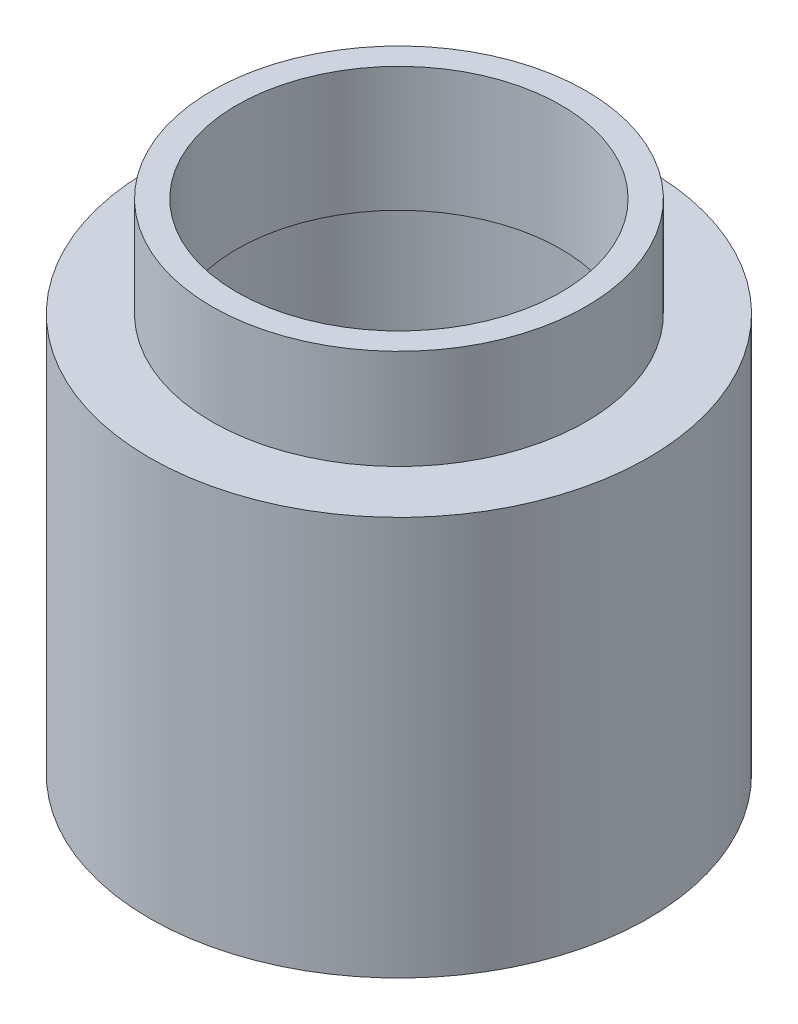
ISO-10303-21;
HEADER;
FILE_DESCRIPTION(('STEP AP214'),'2;1');
FILE_NAME('part.step','',(''),(''),'','','');
FILE_SCHEMA(('AUTOMOTIVE_DESIGN { 1 0 10303 214 1 1 1 1 }'));
ENDSEC;
DATA;
#1=APPLICATION_CONTEXT('core data for automotive mechanical design processes');
#2=APPLICATION_PROTOCOL_DEFINITION('international standard','automotive_design',2000,#1);
#3=PRODUCT_CONTEXT('',#1,'mechanical');
#4=PRODUCT('Part','Part','',(#3));
#5=PRODUCT_RELATED_PRODUCT_CATEGORY('part','',(#4));
#6=PRODUCT_DEFINITION_FORMATION('','',#4);
#7=PRODUCT_DEFINITION_CONTEXT('part definition',#1,'design');
#8=PRODUCT_DEFINITION('design','',#6,#7);
#9=PRODUCT_DEFINITION_SHAPE('','',#8);
#10=(LENGTH_UNIT() NAMED_UNIT(*) SI_UNIT(.MILLI.,.METRE.));
#11=(NAMED_UNIT(*) PLANE_ANGLE_UNIT() SI_UNIT($,.RADIAN.));
#12=(NAMED_UNIT(*) SI_UNIT($,.STERADIAN.) SOLID_ANGLE_UNIT());
#13=UNCERTAINTY_MEASURE_WITH_UNIT(LENGTH_MEASURE(1.E-05),#10,'distance_accuracy_value','');
#14=(GEOMETRIC_REPRESENTATION_CONTEXT(3) GLOBAL_UNCERTAINTY_ASSIGNED_CONTEXT((#13)) GLOBAL_UNIT_ASSIGNED_CONTEXT((#10,
#11,#12)) REPRESENTATION_CONTEXT('',''));
#15=CARTESIAN_POINT('',(0.,0.,0.));
#16=DIRECTION('',(0.,0.,1.));
#17=DIRECTION('',(1.,0.,0.));
#18=AXIS2_PLACEMENT_3D('',#15,#16,#17);
#19=CARTESIAN_POINT('',(0.,0.,0.));
#20=DIRECTION('',(0.,1.,0.));
#21=DIRECTION('',(0.,0.,1.));
#22=AXIS2_PLACEMENT_3D('',#19,#20,#21);
#23=PLANE('',#22);
#24=CARTESIAN_POINT('',(0.,0.,0.));
#25=DIRECTION('',(0.,1.,0.));
#26=DIRECTION('',(0.,0.,1.));
#27=AXIS2_PLACEMENT_3D('',#24,#25,#26);
#28=CIRCLE('',#27,16.51);
#29=CARTESIAN_POINT('',(0.,0.,16.51));
#30=VERTEX_POINT('',#29);
#31=EDGE_CURVE('E119',#30,#30,#28,.T.);
#32=ORIENTED_EDGE('',*,*,#31,.T.);
#33=EDGE_LOOP('',(#32));
#34=FACE_BOUND('',#33,.T.);
#35=CARTESIAN_POINT('',(0.,0.,0.));
#36=DIRECTION('',(0.,1.,0.));
#37=DIRECTION('',(0.,0.,1.));
#38=AXIS2_PLACEMENT_3D('',#35,#36,#37);
#39=CIRCLE('',#38,19.05);
#40=CARTESIAN_POINT('',(0.,0.,19.05));
#41=VERTEX_POINT('',#40);
#42=EDGE_CURVE('E10',#41,#41,#39,.T.);
#43=ORIENTED_EDGE('',*,*,#42,.F.);
#44=EDGE_LOOP('',(#43));
#45=FACE_BOUND('',#44,.T.);
#46=ADVANCED_FACE('F43',(#34,#45),#23,.F.);
#47=CARTESIAN_POINT('',(0.,12.7,0.));
#48=DIRECTION('',(0.,-1.,0.));
#49=DIRECTION('',(0.,0.,-1.));
#50=AXIS2_PLACEMENT_3D('',#47,#48,#49);
#51=CYLINDRICAL_SURFACE('',#50,19.05);
#52=CARTESIAN_POINT('',(0.,2.54,0.));
#53=DIRECTION('',(0.,1.,0.));
#54=DIRECTION('',(0.,0.,1.));
#55=AXIS2_PLACEMENT_3D('',#52,#53,#54);
#56=CIRCLE('',#55,19.05);
#57=CARTESIAN_POINT('',(0.,2.54,19.05));
#58=VERTEX_POINT('',#57);
#59=EDGE_CURVE('E66',#58,#58,#56,.T.);
#60=ORIENTED_EDGE('',*,*,#59,.T.);
#61=EDGE_LOOP('',(#60));
#62=FACE_BOUND('',#61,.T.);
#63=CARTESIAN_POINT('',(0.,12.7,0.));
#64=DIRECTION('',(0.,1.,0.));
#65=DIRECTION('',(0.,0.,1.));
#66=AXIS2_PLACEMENT_3D('',#63,#64,#65);
#67=CIRCLE('',#66,19.05);
#68=CARTESIAN_POINT('',(0.,12.7,19.05));
#69=VERTEX_POINT('',#68);
#70=EDGE_CURVE('E47',#69,#69,#67,.T.);
#71=ORIENTED_EDGE('',*,*,#70,.F.);
#72=EDGE_LOOP('',(#71));
#73=FACE_BOUND('',#72,.T.);
#74=ADVANCED_FACE('F45',(#62,#73),#51,.T.);
#75=CARTESIAN_POINT('',(0.,12.7,0.));
#76=DIRECTION('',(0.,1.,0.));
#77=DIRECTION('',(0.,0.,1.));
#78=AXIS2_PLACEMENT_3D('',#75,#76,#77);
#79=PLANE('',#78);
#80=CARTESIAN_POINT('',(0.,12.7,0.));
#81=DIRECTION('',(0.,1.,0.));
#82=DIRECTION('',(0.,0.,1.));
#83=AXIS2_PLACEMENT_3D('',#80,#81,#82);
#84=CIRCLE('',#83,16.51);
#85=CARTESIAN_POINT('',(0.,12.7,16.51));
#86=VERTEX_POINT('',#85);
#87=EDGE_CURVE('E57',#86,#86,#84,.T.);
#88=ORIENTED_EDGE('',*,*,#87,.F.);
#89=EDGE_LOOP('',(#88));
#90=FACE_BOUND('',#89,.T.);
#91=ORIENTED_EDGE('',*,*,#70,.T.);
#92=EDGE_LOOP('',(#91));
#93=FACE_BOUND('',#92,.T.);
#94=ADVANCED_FACE('F106',(#90,#93),#79,.T.);
#95=CARTESIAN_POINT('',(0.,12.7,0.));
#96=DIRECTION('',(0.,-1.,0.));
#97=DIRECTION('',(0.,0.,-1.));
#98=AXIS2_PLACEMENT_3D('',#95,#96,#97);
#99=CYLINDRICAL_SURFACE('',#98,16.51);
#100=ORIENTED_EDGE('',*,*,#87,.T.);
#101=EDGE_LOOP('',(#100));
#102=FACE_BOUND('',#101,.T.);
#103=ORIENTED_EDGE('',*,*,#31,.F.);
#104=EDGE_LOOP('',(#103));
#105=FACE_BOUND('',#104,.T.);
#106=ADVANCED_FACE('F99',(#102,#105),#99,.F.);
#107=CARTESIAN_POINT('',(0.,2.54,0.));
#108=DIRECTION('',(0.,1.,0.));
#109=DIRECTION('',(0.,0.,1.));
#110=AXIS2_PLACEMENT_3D('',#107,#108,#109);
#111=PLANE('',#110);
#112=CARTESIAN_POINT('',(0.,2.54,0.));
#113=DIRECTION('',(0.,1.,0.));
#114=DIRECTION('',(0.,0.,1.));
#115=AXIS2_PLACEMENT_3D('',#112,#113,#114);
#116=CIRCLE('',#115,25.4);
#117=CARTESIAN_POINT('',(0.,2.54,25.4));
#118=VERTEX_POINT('',#117);
#119=EDGE_CURVE('E122',#118,#118,#116,.T.);
#120=ORIENTED_EDGE('',*,*,#119,.T.);
#121=EDGE_LOOP('',(#120));
#122=FACE_BOUND('',#121,.T.);
#123=ORIENTED_EDGE('',*,*,#59,.F.);
#124=EDGE_LOOP('',(#123));
#125=FACE_BOUND('',#124,.T.);
#126=ADVANCED_FACE('F95',(#122,#125),#111,.T.);
#127=CARTESIAN_POINT('',(0.,2.54,0.));
#128=DIRECTION('',(0.,-1.,0.));
#129=DIRECTION('',(0.,0.,-1.));
#130=AXIS2_PLACEMENT_3D('',#127,#128,#129);
#131=CYLINDRICAL_SURFACE('',#130,25.4);
#132=ORIENTED_EDGE('',*,*,#119,.F.);
#133=EDGE_LOOP('',(#132));
#134=FACE_BOUND('',#133,.T.);
#135=CARTESIAN_POINT('',(-23.5464301965287,-19.05,-9.525));
#136=CARTESIAN_POINT('',(-23.5464290597665,-19.3071777852419,-9.52500125222874));
#137=CARTESIAN_POINT('',(-23.5506548764508,-19.5643386914946,-9.51457581781126));
#138=CARTESIAN_POINT('',(-23.5674130086475,-20.0767067934272,-9.47299060902992));
#139=CARTESIAN_POINT('',(-23.5799451961018,-20.3319140191654,-9.44183115431928));
#140=CARTESIAN_POINT('',(-23.6129001050751,-20.8384520206948,-9.35910904505806));
#141=CARTESIAN_POINT('',(-23.6333221967351,-21.0897831042571,-9.30754801917728));
#142=CARTESIAN_POINT('',(-23.6813986634046,-21.586821539874,-9.18453650181596));
#143=CARTESIAN_POINT('',(-23.7090532513456,-21.832528726124,-9.11308542474942));
#144=CARTESIAN_POINT('',(-23.7706548641663,-22.3160399526018,-8.95116981501976));
#145=CARTESIAN_POINT('',(-23.804585070284,-22.5538631590036,-8.86075601798978));
#146=CARTESIAN_POINT('',(-23.8777983041001,-23.0209066882999,-8.66152453393985));
#147=CARTESIAN_POINT('',(-23.9170832005942,-23.250123971933,-8.55270041847714));
#148=CARTESIAN_POINT('',(-23.9998946503517,-23.6985632919238,-8.31748730151723));
#149=CARTESIAN_POINT('',(-24.0434213632411,-23.9177849516752,-8.19109763892608));
#150=CARTESIAN_POINT('',(-24.1335514315899,-24.3450496760543,-7.9216082893283));
#151=CARTESIAN_POINT('',(-24.180155004329,-24.553091949338,-7.77850742167155));
#152=CARTESIAN_POINT('',(-24.2773902026361,-24.9660265194793,-7.46965191018819));
#153=CARTESIAN_POINT('',(-24.3281086845112,-25.170351551261,-7.30316574399795));
#154=CARTESIAN_POINT('',(-24.4302238492155,-25.5644215558846,-6.95393804783615));
#155=CARTESIAN_POINT('',(-24.4816205471923,-25.7541662024328,-6.7711961542757));
#156=CARTESIAN_POINT('',(-24.5837456766822,-26.1180036584668,-6.39048448784824));
#157=CARTESIAN_POINT('',(-24.6344739537302,-26.2920929024692,-6.19251126503328));
#158=CARTESIAN_POINT('',(-24.7339242741546,-26.6234814564271,-5.78251509886594));
#159=CARTESIAN_POINT('',(-24.7826463794314,-26.780781284658,-5.57049258953101));
#160=CARTESIAN_POINT('',(-24.8784348859977,-27.0826420848376,-5.12609871382996));
#161=CARTESIAN_POINT('',(-24.9253868752098,-27.2265796385702,-4.89327847619604));
#162=CARTESIAN_POINT('',(-25.0144447274539,-27.4941688553475,-4.41549263047845));
#163=CARTESIAN_POINT('',(-25.0565525342592,-27.617828663559,-4.17053195071252));
#164=CARTESIAN_POINT('',(-25.1347341943146,-27.8438464685769,-3.67005072001727));
#165=CARTESIAN_POINT('',(-25.1708083661773,-27.9462055902585,-3.41453072757281));
#166=CARTESIAN_POINT('',(-25.2358637350264,-28.1286405096969,-2.89478046178847));
#167=CARTESIAN_POINT('',(-25.2648453247438,-28.2087175412929,-2.63055067164786));
#168=CARTESIAN_POINT('',(-25.3137670251751,-28.3428009614553,-2.10697045886651));
#169=CARTESIAN_POINT('',(-25.3340431627404,-28.3977827572438,-1.8479010519304));
#170=CARTESIAN_POINT('',(-25.3667350446999,-28.4860243872021,-1.32559688578523));
#171=CARTESIAN_POINT('',(-25.3791509954178,-28.5192847915419,-1.0623622360964));
#172=CARTESIAN_POINT('',(-25.3957651101869,-28.5637235453757,-0.533850308196677));
#173=CARTESIAN_POINT('',(-25.3999655577773,-28.5749080309867,-0.268573618168059));
#174=CARTESIAN_POINT('',(-25.4000340149168,-28.5750908295271,0.261984629792008));
#175=CARTESIAN_POINT('',(-25.3959022764224,-28.5640898133224,0.5272661873337));
#176=CARTESIAN_POINT('',(-25.3798361799296,-28.5211180550047,1.04262353852333));
#177=CARTESIAN_POINT('',(-25.3682985678342,-28.4902133237822,1.29280148232164));
#178=CARTESIAN_POINT('',(-25.3381058781439,-28.4087747298098,1.78949444136041));
#179=CARTESIAN_POINT('',(-25.3194510793465,-28.3582416359493,2.0360095996882));
#180=CARTESIAN_POINT('',(-25.2755020244822,-28.238022299151,2.52367464887114));
#181=CARTESIAN_POINT('',(-25.2502087103332,-28.1683387733412,2.76482529561845));
#182=CARTESIAN_POINT('',(-25.1936024946416,-28.010394281841,3.24033174905699));
#183=CARTESIAN_POINT('',(-25.1622873026068,-27.9221262460972,3.47468493109316));
#184=CARTESIAN_POINT('',(-25.0939280822682,-27.7263690283485,3.93833241293282));
#185=CARTESIAN_POINT('',(-25.0568092881533,-27.6186256343564,4.16750827246817));
#186=CARTESIAN_POINT('',(-24.97807179511,-27.3855698511999,4.61603742377733));
#187=CARTESIAN_POINT('',(-24.9364514452915,-27.2602510114247,4.83538706991793));
#188=CARTESIAN_POINT('',(-24.8497227904938,-26.9929420173091,5.26297195415743));
#189=CARTESIAN_POINT('',(-24.8046142267526,-26.8509506257628,5.47120636576771));
#190=CARTESIAN_POINT('',(-24.7119849492327,-26.5512091548956,5.8754409825829));
#191=CARTESIAN_POINT('',(-24.664464123718,-26.3934583452699,6.0714406201334));
#192=CARTESIAN_POINT('',(-24.5653044601238,-26.0534124139632,6.46131714145069));
#193=CARTESIAN_POINT('',(-24.5135877499819,-25.8702196366974,6.65439212114292));
#194=CARTESIAN_POINT('',(-24.4101178907345,-25.4884180621478,7.02446113412108));
#195=CARTESIAN_POINT('',(-24.3583647646491,-25.289815494464,7.20146160356529));
#196=CARTESIAN_POINT('',(-24.2561740388739,-24.8781538071072,7.53850505058875));
#197=CARTESIAN_POINT('',(-24.2057373451799,-24.665085076752,7.69853657029526));
#198=CARTESIAN_POINT('',(-24.1076524675075,-24.2259359687333,8.0003922086817));
#199=CARTESIAN_POINT('',(-24.0600031849107,-23.9998607880184,8.14222352738153));
#200=CARTESIAN_POINT('',(-23.9678285375499,-23.5306824556341,8.40973679818271));
#201=CARTESIAN_POINT('',(-23.9233987372099,-23.2873091376557,8.53497865549717));
#202=CARTESIAN_POINT('',(-23.840335948329,-22.7899617693195,8.76431754101062));
#203=CARTESIAN_POINT('',(-23.8017004918262,-22.5359922913952,8.86842357822682));
#204=CARTESIAN_POINT('',(-23.7315183910797,-22.0191914690703,9.05455336827552));
#205=CARTESIAN_POINT('',(-23.6999701007713,-21.7563621987878,9.13658224962521));
#206=CARTESIAN_POINT('',(-23.6450754412344,-21.2237850705233,9.27772367353786));
#207=CARTESIAN_POINT('',(-23.6217285087169,-20.9540376890598,9.33683778997104));
#208=CARTESIAN_POINT('',(-23.5851386611022,-20.4248388104504,9.42886764305426));
#209=CARTESIAN_POINT('',(-23.5714092694367,-20.1656405850583,9.46304907745533));
#210=CARTESIAN_POINT('',(-23.5525103323657,-19.6450021692584,9.5099897241637));
#211=CARTESIAN_POINT('',(-23.5473404711563,-19.3835620619225,9.52274972681493));
#212=CARTESIAN_POINT('',(-23.5457404287336,-18.8605512444613,9.52670515664306));
#213=CARTESIAN_POINT('',(-23.5493083255811,-18.5989805757071,9.51790532607603));
#214=CARTESIAN_POINT('',(-23.5650557589161,-18.077712333086,9.47884957901896));
#215=CARTESIAN_POINT('',(-23.5772351282222,-17.8180147229548,9.44859407906466));
#216=CARTESIAN_POINT('',(-23.6090073205275,-17.3148107371196,9.36891185181175));
#217=CARTESIAN_POINT('',(-23.628218381802,-17.0711233563398,9.32046953398875));
#218=CARTESIAN_POINT('',(-23.6734924042216,-16.588792941596,9.20486870114743));
#219=CARTESIAN_POINT('',(-23.6995577621792,-16.3501517037682,9.13770363866013));
#220=CARTESIAN_POINT('',(-23.7577688433731,-15.8795545605533,8.98526939166543));
#221=CARTESIAN_POINT('',(-23.7899132220107,-15.6475971898333,8.90000421015404));
#222=CARTESIAN_POINT('',(-23.8593997580177,-15.1915814048209,8.7120079557696));
#223=CARTESIAN_POINT('',(-23.8967439350965,-14.9675261024425,8.60927009269498));
#224=CARTESIAN_POINT('',(-23.9770865535003,-14.5204932861121,8.38297440303938));
#225=CARTESIAN_POINT('',(-24.0202432424086,-14.2978633851671,8.25878613594989));
#226=CARTESIAN_POINT('',(-24.1099023102733,-13.8636552952139,7.99326262957687));
#227=CARTESIAN_POINT('',(-24.1564061724229,-13.6520820781934,7.85191976950677));
#228=CARTESIAN_POINT('',(-24.2515277559896,-13.2411981868087,7.55301232322762));
#229=CARTESIAN_POINT('',(-24.300145685448,-13.041888723979,7.3954461384161));
#230=CARTESIAN_POINT('',(-24.3982614149993,-12.6566051530506,7.06502224550078));
#231=CARTESIAN_POINT('',(-24.4477592437285,-12.4706314799594,6.89216403898877));
#232=CARTESIAN_POINT('',(-24.5495573261128,-12.1016321420379,6.52063241640119));
#233=CARTESIAN_POINT('',(-24.6018353307814,-11.919548254646,6.32101606690111));
#234=CARTESIAN_POINT('',(-24.7045502724577,-11.5728454646602,5.90683487903882));
#235=CARTESIAN_POINT('',(-24.754987849418,-11.4082204525747,5.69227531368163));
#236=CARTESIAN_POINT('',(-24.8526837942627,-11.0974348700793,5.249338557052));
#237=CARTESIAN_POINT('',(-24.8999407629226,-10.9512824016744,5.02095536727513));
#238=CARTESIAN_POINT('',(-24.9899267545733,-10.6787029987675,4.55198143954471));
#239=CARTESIAN_POINT('',(-25.0326577143075,-10.5522676160165,4.31139598882043));
#240=CARTESIAN_POINT('',(-25.1122880914012,-10.3204839111231,3.82029576848357));
#241=CARTESIAN_POINT('',(-25.149205696098,-10.2150695365466,3.5698151619456));
#242=CARTESIAN_POINT('',(-25.2163200404727,-10.0257960297509,3.05995235124164));
#243=CARTESIAN_POINT('',(-25.2465167456233,-9.9419370082673,2.80057010135325));
#244=CARTESIAN_POINT('',(-25.299295784839,-9.79664517418848,2.27494324740567));
#245=CARTESIAN_POINT('',(-25.3218810698969,-9.73520366942293,2.0087013460705));
#246=CARTESIAN_POINT('',(-25.3587770160651,-9.63536483826512,1.47136991413814));
#247=CARTESIAN_POINT('',(-25.3730881530876,-9.59696618648971,1.20028066327552));
#248=CARTESIAN_POINT('',(-25.3924228449267,-9.54519611945499,0.671388002777045));
#249=CARTESIAN_POINT('',(-25.3979394015329,-9.53049564972833,0.413731858735038));
#250=CARTESIAN_POINT('',(-25.4011039188786,-9.5220556426682,-0.101966351062404));
#251=CARTESIAN_POINT('',(-25.3987522044313,-9.52831524007435,-0.360008400447584));
#252=CARTESIAN_POINT('',(-25.3862451729956,-9.56172793143172,-0.87451230794166));
#253=CARTESIAN_POINT('',(-25.3760907453383,-9.58887864427388,-1.13097434277835));
#254=CARTESIAN_POINT('',(-25.3482544470697,-9.66379541281054,-1.64045214939321));
#255=CARTESIAN_POINT('',(-25.3305725817149,-9.71156145410952,-1.89346792357775));
#256=CARTESIAN_POINT('',(-25.2886781423474,-9.82581357119041,-2.38806145838755));
#257=CARTESIAN_POINT('',(-25.2646373033226,-9.89180914843507,-2.6297674266934));
#258=CARTESIAN_POINT('',(-25.2104358600319,-10.0424122873472,-3.10669395335431));
#259=CARTESIAN_POINT('',(-25.1802730864285,-10.1270264474974,-3.34191217909091));
#260=CARTESIAN_POINT('',(-25.1145774610085,-10.314137476132,-3.80427620586803));
#261=CARTESIAN_POINT('',(-25.0790458524841,-10.4166302052192,-4.03142386085422));
#262=CARTESIAN_POINT('',(-25.0034419535676,-10.6387787219132,-4.47647923989422));
#263=CARTESIAN_POINT('',(-24.9633679099967,-10.7584411410291,-4.69438335145395));
#264=CARTESIAN_POINT('',(-24.8778841649032,-11.0193980481146,-5.12853235655687));
#265=CARTESIAN_POINT('',(-24.8323218063429,-11.1613856050804,-5.34433069314777));
#266=CARTESIAN_POINT('',(-24.7384203940128,-11.4621489620928,-5.76339264355948));
#267=CARTESIAN_POINT('',(-24.6900800947624,-11.620932319729,-5.96665054888657));
#268=CARTESIAN_POINT('',(-24.5918396142337,-11.9542575198173,-6.35943519656763));
#269=CARTESIAN_POINT('',(-24.5419392780876,-12.1288009300674,-6.54896056943187));
#270=CARTESIAN_POINT('',(-24.441830648007,-12.4926154585387,-6.91321918835163));
#271=CARTESIAN_POINT('',(-24.3916223470365,-12.6818869144081,-7.08795209509013));
#272=CARTESIAN_POINT('',(-24.2895319279912,-13.0845255356631,-7.43049493763688));
#273=CARTESIAN_POINT('',(-24.2377023859995,-13.2986383889335,-7.59744536565725));
#274=CARTESIAN_POINT('',(-24.1366362947896,-13.7406589745732,-7.91265963708757));
#275=CARTESIAN_POINT('',(-24.0873987945696,-13.9685615806806,-8.0609303621589));
#276=CARTESIAN_POINT('',(-23.9929513627474,-14.4369775692208,-8.33784791070401));
#277=CARTESIAN_POINT('',(-23.9477436999042,-14.6774979358009,-8.46648370857341));
#278=CARTESIAN_POINT('',(-23.8628356936396,-15.1693813237319,-8.70292216517828));
#279=CARTESIAN_POINT('',(-23.8231330061718,-15.4207396700742,-8.81073369872558));
#280=CARTESIAN_POINT('',(-23.7489279580391,-15.9440092618361,-9.00889139010164));
#281=CARTESIAN_POINT('',(-23.7147331802954,-16.2163378502519,-9.09825444597654));
#282=CARTESIAN_POINT('',(-23.6550750638227,-16.7688568674462,-9.25225690722239));
#283=CARTESIAN_POINT('',(-23.6296121179307,-17.0490476493243,-9.31689520026435));
#284=CARTESIAN_POINT('',(-23.5884513939255,-17.614672116342,-9.42062006137293));
#285=CARTESIAN_POINT('',(-23.5727481492134,-17.9001027741122,-9.45972093407209));
#286=CARTESIAN_POINT('',(-23.5517387963821,-18.4736962333098,-9.51190867801163));
#287=CARTESIAN_POINT('',(-23.546431470154,-18.7618587106685,-9.52499859700634));
#288=CARTESIAN_POINT('',(-23.5464301965287,-19.05,-9.525));
#289=B_SPLINE_CURVE_WITH_KNOTS('',3,(#135,#136,#137,#138,#139,#140,#141,#142,#143,#144,#145,
#146,#147,#148,#149,#150,#151,#152,#153,#154,#155,#156,#157,#158,#159,#160,#161,#162,#163,#164,
#165,#166,#167,#168,#169,#170,#171,#172,#173,#174,#175,#176,#177,#178,#179,#180,#181,#182,#183,
#184,#185,#186,#187,#188,#189,#190,#191,#192,#193,#194,#195,#196,#197,#198,#199,#200,#201,#202,
#203,#204,#205,#206,#207,#208,#209,#210,#211,#212,#213,#214,#215,#216,#217,#218,#219,#220,#221,
#222,#223,#224,#225,#226,#227,#228,#229,#230,#231,#232,#233,#234,#235,#236,#237,#238,#239,#240,
#241,#242,#243,#244,#245,#246,#247,#248,#249,#250,#251,#252,#253,#254,#255,#256,#257,#258,#259,
#260,#261,#262,#263,#264,#265,#266,#267,#268,#269,#270,#271,#272,#273,#274,#275,#276,#277,#278,
#279,#280,#281,#282,#283,#284,#285,#286,#287,#288),.UNSPECIFIED.,.T.,.F.,(4,2,2,2,2,2,2,2,2,2,2,
2,2,2,2,2,2,2,2,2,2,2,2,2,2,2,2,2,2,2,2,2,2,2,2,2,2,2,2,2,2,2,2,2,2,2,2,2,2,2,2,2,2,2,2,2,2,2,2,
2,2,2,2,2,2,2,2,2,2,2,2,2,2,2,2,2,4),(0.,0.771259809427028,1.54250772873512,2.31369409127157,
3.08490316082341,3.85407456304835,4.62351509796991,5.3929845992706,6.16250849667797,
6.96680952769195,7.77112855288545,8.57563029848293,9.38010720259339,10.2122259818743,
11.0440096924791,11.8757494659874,12.7074431739163,13.5032685607861,14.299073057008,
15.094656324043,15.8902155338532,16.6463565429429,17.4024679351818,18.1584721031182,
18.9147643969684,19.6817539764796,20.4490257998925,21.2163545956149,21.9837189665195,
22.7961869577687,23.6083281930449,24.4210143610544,25.2333780318109,26.0641974574152,
26.8946620042389,27.7249334675403,28.5551478946396,29.339548400318,30.1239199648961,
30.9081190162259,31.6923028437015,32.4390419311283,33.186042486521,33.9328780081518,
34.680004429622,35.454816941628,36.2299749263249,37.0052093662232,37.7804690824181,
38.6050943840852,39.4294301607026,40.2541262431857,41.0784679885576,41.9001771843379,
42.7218906013767,43.5432850677226,44.3646322844182,45.13807579785,45.911487382864,
46.6848108297119,47.4581337365555,48.2123932809585,48.9669205690249,49.7212733938678,
50.4759183632475,51.2619732373368,52.0483833286078,52.8348717377329,53.6213781828382,
54.449624018885,55.2775638287073,56.1059668548181,56.9340160522824,57.7986805873485,
58.6633840177659,59.5276026733962,60.3917200608636),.UNSPECIFIED.);
#290=CARTESIAN_POINT('',(-23.5464301965287,-19.05,-9.525));
#291=VERTEX_POINT('',#290);
#292=EDGE_CURVE('E76',#291,#291,#289,.T.);
#293=ORIENTED_EDGE('',*,*,#292,.F.);
#294=EDGE_LOOP('',(#293));
#295=FACE_BOUND('',#294,.T.);
#296=CARTESIAN_POINT('',(0.,-38.1,0.));
#297=DIRECTION('',(0.,1.,0.));
#298=DIRECTION('',(0.,0.,1.));
#299=AXIS2_PLACEMENT_3D('',#296,#297,#298);
#300=CIRCLE('',#299,25.4);
#301=CARTESIAN_POINT('',(0.,-38.1,25.4));
#302=VERTEX_POINT('',#301);
#303=EDGE_CURVE('E62',#302,#302,#300,.T.);
#304=ORIENTED_EDGE('',*,*,#303,.T.);
#305=EDGE_LOOP('',(#304));
#306=FACE_BOUND('',#305,.T.);
#307=ADVANCED_FACE('F98',(#134,#295,#306),#131,.T.);
#308=CARTESIAN_POINT('',(0.,-38.1,0.));
#309=DIRECTION('',(0.,1.,0.));
#310=DIRECTION('',(0.,0.,1.));
#311=AXIS2_PLACEMENT_3D('',#308,#309,#310);
#312=PLANE('',#311);
#313=CARTESIAN_POINT('',(0.,-38.1,0.));
#314=DIRECTION('',(0.,1.,0.));
#315=DIRECTION('',(0.,0.,1.));
#316=AXIS2_PLACEMENT_3D('',#313,#314,#315);
#317=CIRCLE('',#316,19.05);
#318=CARTESIAN_POINT('',(0.,-38.1,19.05));
#319=VERTEX_POINT('',#318);
#320=EDGE_CURVE('E60',#319,#319,#317,.T.);
#321=ORIENTED_EDGE('',*,*,#320,.T.);
#322=EDGE_LOOP('',(#321));
#323=FACE_BOUND('',#322,.T.);
#324=ORIENTED_EDGE('',*,*,#303,.F.);
#325=EDGE_LOOP('',(#324));
#326=FACE_BOUND('',#325,.T.);
#327=ADVANCED_FACE('F94',(#323,#326),#312,.F.);
#328=CARTESIAN_POINT('',(0.,-38.1,0.));
#329=DIRECTION('',(0.,1.,0.));
#330=DIRECTION('',(0.,0.,1.));
#331=AXIS2_PLACEMENT_3D('',#328,#329,#330);
#332=CYLINDRICAL_SURFACE('',#331,19.05);
#333=CARTESIAN_POINT('',(-16.4977839420935,-19.05,-9.525));
#334=CARTESIAN_POINT('',(-16.4977853656791,-19.2982815461669,-9.52499893158731));
#335=CARTESIAN_POINT('',(-16.5034078213905,-19.5465847096671,-9.51527938544775));
#336=CARTESIAN_POINT('',(-16.5256889646294,-20.0412776819667,-9.47652846767385));
#337=CARTESIAN_POINT('',(-16.542352790077,-20.28766654595,-9.4474881053891));
#338=CARTESIAN_POINT('',(-16.5861271292646,-20.7769045764213,-9.37042405876233));
#339=CARTESIAN_POINT('',(-16.6132540241221,-21.0197475695899,-9.32237060421498));
#340=CARTESIAN_POINT('',(-16.6769935347612,-21.4998771355852,-9.20785922395377));
#341=CARTESIAN_POINT('',(-16.7136102750745,-21.737161243359,-9.14139329483575));
#342=CARTESIAN_POINT('',(-16.7948606495754,-22.2032261819251,-8.9912396264758));
#343=CARTESIAN_POINT('',(-16.8394466356085,-22.4320482938612,-8.9076538356842));
#344=CARTESIAN_POINT('',(-16.9354335612595,-22.8814829025552,-8.72378024356317));
#345=CARTESIAN_POINT('',(-16.986836970711,-23.1020923867491,-8.62348638580447));
#346=CARTESIAN_POINT('',(-17.0949953947188,-23.5339369819112,-8.40703629022837));
#347=CARTESIAN_POINT('',(-17.1517491460545,-23.7451742884245,-8.29088379376152));
#348=CARTESIAN_POINT('',(-17.2691613838181,-24.1574570779133,-8.04346401373142));
#349=CARTESIAN_POINT('',(-17.3298199988872,-24.3585022247301,-7.91219623210086));
#350=CARTESIAN_POINT('',(-17.4587191204022,-24.7657977577085,-7.62381683441163));
#351=CARTESIAN_POINT('',(-17.5271718512694,-24.9711043422387,-7.46546581949684));
#352=CARTESIAN_POINT('',(-17.6651569415412,-25.3678705274045,-7.13282155068231));
#353=CARTESIAN_POINT('',(-17.7346890193927,-25.5593336678216,-6.95853239817838));
#354=CARTESIAN_POINT('',(-17.8731644576324,-25.9276648453173,-6.59472443644508));
#355=CARTESIAN_POINT('',(-17.9421074653444,-26.1045246226762,-6.40519712644622));
#356=CARTESIAN_POINT('',(-18.0777056760085,-26.4426009993265,-6.0118500774592));
#357=CARTESIAN_POINT('',(-18.1443605307913,-26.6038152247219,-5.80802817761326));
#358=CARTESIAN_POINT('',(-18.2781556110993,-26.9199414849309,-5.37278298403567));
#359=CARTESIAN_POINT('',(-18.3450226984476,-27.0736863255266,-5.14042525128088));
#360=CARTESIAN_POINT('',(-18.4724151577049,-27.3608240831385,-4.66193516488929));
#361=CARTESIAN_POINT('',(-18.5329432311122,-27.4942256809835,-4.4158087482273));
#362=CARTESIAN_POINT('',(-18.6459386410143,-27.7394183342884,-3.91130016151597));
#363=CARTESIAN_POINT('',(-18.6984079380061,-27.8512146474833,-3.65292099233343));
#364=CARTESIAN_POINT('',(-18.7937254274744,-28.051946990072,-3.12571719774862));
#365=CARTESIAN_POINT('',(-18.8365746418144,-28.140885447616,-2.85689368532611));
#366=CARTESIAN_POINT('',(-18.9086548110836,-28.2892774079615,-2.33040190388449));
#367=CARTESIAN_POINT('',(-18.9386376891974,-28.3503783076476,-2.07330045242685));
#368=CARTESIAN_POINT('',(-18.9883069027157,-28.4511089614836,-1.55394008602794));
#369=CARTESIAN_POINT('',(-19.0079936857898,-28.490739649151,-1.29168139583556));
#370=CARTESIAN_POINT('',(-19.0364916490919,-28.5479869279157,-0.76431852249774));
#371=CARTESIAN_POINT('',(-19.0453083714973,-28.5656147373931,-0.499215858979532));
#372=CARTESIAN_POINT('',(-19.0518227048738,-28.5786467670526,0.0316650577134554));
#373=CARTESIAN_POINT('',(-19.0495209961279,-28.5740523469053,0.297443268560283));
#374=CARTESIAN_POINT('',(-19.0345541693077,-28.5440780810534,0.804258022684556));
#375=CARTESIAN_POINT('',(-19.0228089903957,-28.5205431491467,1.04543361411354));
#376=CARTESIAN_POINT('',(-18.990405491011,-28.4552873017026,1.5246879378112));
#377=CARTESIAN_POINT('',(-18.9697477980553,-28.4135676665212,1.76276688689442));
#378=CARTESIAN_POINT('',(-18.9200137081154,-28.312396120125,2.23422861279271));
#379=CARTESIAN_POINT('',(-18.8909370368835,-28.2529436312618,2.46761123636039));
#380=CARTESIAN_POINT('',(-18.8250432607481,-28.1169132321885,2.92820475288449));
#381=CARTESIAN_POINT('',(-18.7882258778315,-28.0403347068786,3.15541542383986));
#382=CARTESIAN_POINT('',(-18.707126571983,-27.8696051164943,3.60539471515864));
#383=CARTESIAN_POINT('',(-18.6627500716287,-27.7752295417861,3.82806111323847));
#384=CARTESIAN_POINT('',(-18.5678757614817,-27.5704075848537,4.26455898991279));
#385=CARTESIAN_POINT('',(-18.5173757829585,-27.4599555060805,4.47838730219157));
#386=CARTESIAN_POINT('',(-18.3583041521176,-27.1057547349091,5.10494218255807));
#387=CARTESIAN_POINT('',(-18.2421099283529,-26.8390576905606,5.50300988352718));
#388=CARTESIAN_POINT('',(-17.9873974662411,-26.2232393932002,6.2882670168958));
#389=CARTESIAN_POINT('',(-17.8478072421174,-25.868709846822,6.6708712495109));
#390=CARTESIAN_POINT('',(-17.6389441335899,-25.2939819076266,7.19764296643497));
#391=CARTESIAN_POINT('',(-17.5693587710268,-25.0950870031449,7.36548461299789));
#392=CARTESIAN_POINT('',(-17.432102200963,-24.6837301532774,7.68468913395939));
#393=CARTESIAN_POINT('',(-17.3644312838598,-24.4712661653846,7.83604951817136));
#394=CARTESIAN_POINT('',(-17.2286625909359,-24.019827134636,8.13041408214943));
#395=CARTESIAN_POINT('',(-17.1608135894673,-23.7800255500561,8.2722671535747));
#396=CARTESIAN_POINT('',(-17.0316745130201,-23.2876242347305,8.53498596426943));
#397=CARTESIAN_POINT('',(-16.9703814919226,-23.035030328417,8.65586114589069));
#398=CARTESIAN_POINT('',(-16.8565962282786,-22.5186212385501,8.8754131476428));
#399=CARTESIAN_POINT('',(-16.8040987877094,-22.2548127989815,8.97410309070182));
#400=CARTESIAN_POINT('',(-16.7099899643467,-21.7177202902795,9.14814442786865));
#401=CARTESIAN_POINT('',(-16.6683770972985,-21.4444375188577,9.22349900431833));
#402=CARTESIAN_POINT('',(-16.6006697082337,-20.912609242134,9.34476848380717));
#403=CARTESIAN_POINT('',(-16.5736071838972,-20.6546106600195,9.39254228180692));
#404=CARTESIAN_POINT('',(-16.5313665404816,-20.1345872285642,9.46669192104929));
#405=CARTESIAN_POINT('',(-16.5161877498072,-19.8725626076038,9.49306897150692));
#406=CARTESIAN_POINT('',(-16.498367092485,-19.3469602637794,9.52400673855604));
#407=CARTESIAN_POINT('',(-16.4957176518482,-19.0833835756587,9.52858063516223));
#408=CARTESIAN_POINT('',(-16.5030519871288,-18.5569451876365,9.5158726874113));
#409=CARTESIAN_POINT('',(-16.5130349103118,-18.2940834406739,9.49859231830371));
#410=CARTESIAN_POINT('',(-16.5434282995932,-17.8001581683562,9.44554291234891));
#411=CARTESIAN_POINT('',(-16.5625738931774,-17.5687713946523,9.4120115114425));
#412=CARTESIAN_POINT('',(-16.6098986320429,-17.109908184206,9.32824106377329));
#413=CARTESIAN_POINT('',(-16.6380807680423,-16.882433068357,9.27799648544051));
#414=CARTESIAN_POINT('',(-16.7025952935648,-16.4328850983345,9.16134514480864));
#415=CARTESIAN_POINT('',(-16.7389265952861,-16.2108115275103,9.09494053955092));
#416=CARTESIAN_POINT('',(-16.8186803276644,-15.7731863101299,8.94659535953708));
#417=CARTESIAN_POINT('',(-16.8621055697583,-15.557637289661,8.86464862311575));
#418=CARTESIAN_POINT('',(-17.0055391233072,-14.902969221544,8.58828310102921));
#419=CARTESIAN_POINT('',(-17.1156056340822,-14.4764066527232,8.36867208293023));
#420=CARTESIAN_POINT('',(-17.3503937789684,-13.6637933428022,7.87032062574608));
#421=CARTESIAN_POINT('',(-17.4751229267059,-13.2777635655589,7.59154981176671));
#422=CARTESIAN_POINT('',(-17.6727669998016,-12.7107219746996,7.11411202464901));
#423=CARTESIAN_POINT('',(-17.7445383037912,-12.5137607773303,6.93358198082814));
#424=CARTESIAN_POINT('',(-17.8873007944622,-12.135571673472,6.55649001693953));
#425=CARTESIAN_POINT('',(-17.9582922059687,-11.9543391229821,6.35993286246885));
#426=CARTESIAN_POINT('',(-18.0977258366553,-11.60850375786,5.95158869038263));
#427=CARTESIAN_POINT('',(-18.1661661097489,-11.4439134809372,5.73979039321954));
#428=CARTESIAN_POINT('',(-18.2986626901187,-11.1326771188649,5.3022320942894));
#429=CARTESIAN_POINT('',(-18.3627208579967,-10.9860233969161,5.07647809647235));
#430=CARTESIAN_POINT('',(-18.4864498538814,-10.7080662890881,4.60591098675261));
#431=CARTESIAN_POINT('',(-18.545957478642,-10.577278477313,4.36074958081792));
#432=CARTESIAN_POINT('',(-18.6569369974423,-10.3370339484618,3.8584135518028));
#433=CARTESIAN_POINT('',(-18.7084086221551,-10.2275779462916,3.60123852646056));
#434=CARTESIAN_POINT('',(-18.8017565171804,-10.0313181422675,3.07689828480777));
#435=CARTESIAN_POINT('',(-18.8436396393146,-9.94449815880417,2.80974036194899));
#436=CARTESIAN_POINT('',(-18.91655691545,-9.79453934322816,2.26741988314641));
#437=CARTESIAN_POINT('',(-18.9475923559087,-9.73139770296867,1.99225828057708));
#438=CARTESIAN_POINT('',(-18.9955154401088,-9.63435697080585,1.46190176588602));
#439=CARTESIAN_POINT('',(-19.0134402384949,-9.59830566891229,1.20719251140161));
#440=CARTESIAN_POINT('',(-19.0390362053558,-9.54692016970228,0.695184026687687));
#441=CARTESIAN_POINT('',(-19.0467080245842,-9.53158465756004,0.437884961877151));
#442=CARTESIAN_POINT('',(-19.0515840048496,-9.52183151331314,-0.0771295830396143));
#443=CARTESIAN_POINT('',(-19.0487912845084,-9.52740764916019,-0.334844916208118));
#444=CARTESIAN_POINT('',(-19.0328228984352,-9.55939065363813,-0.848650424652564));
#445=CARTESIAN_POINT('',(-19.0196475185374,-9.58579694881534,-1.10474064447219));
#446=CARTESIAN_POINT('',(-18.9844860124329,-9.65666685933728,-1.59639169534844));
#447=CARTESIAN_POINT('',(-18.9631409345111,-9.69981928141251,-1.83218922557212));
#448=CARTESIAN_POINT('',(-18.9122136397456,-9.80354166402616,-2.2990957900371));
#449=CARTESIAN_POINT('',(-18.8826286124255,-9.86411756758502,-2.53020319566794));
#450=CARTESIAN_POINT('',(-18.8159108597938,-10.0020573171102,-2.98614719862675));
#451=CARTESIAN_POINT('',(-18.7787803461188,-10.0794162442988,-3.21098561153205));
#452=CARTESIAN_POINT('',(-18.6977699033897,-10.2502624698466,-3.65328284259683));
#453=CARTESIAN_POINT('',(-18.6538873488234,-10.3437560438449,-3.87073874976685));
#454=CARTESIAN_POINT('',(-18.5583298780291,-10.5503837494762,-4.30611728341767));
#455=CARTESIAN_POINT('',(-18.5064035601498,-10.6641822620439,-4.52366922494709));
#456=CARTESIAN_POINT('',(-18.3973758417675,-10.9076165610448,-4.94845122759907));
#457=CARTESIAN_POINT('',(-18.3402726788125,-11.0372577463675,-5.15567773594862));
#458=CARTESIAN_POINT('',(-18.2221253168113,-11.31150588493,-5.55884758533377));
#459=CARTESIAN_POINT('',(-18.1610803312806,-11.4561158282747,-5.75478865981818));
#460=CARTESIAN_POINT('',(-18.0363505347798,-11.7594459457705,-6.13453422664689));
#461=CARTESIAN_POINT('',(-17.9726655774278,-11.9181669029134,-6.31833804453176));
#462=CARTESIAN_POINT('',(-17.8375767178968,-12.2654332485595,-6.69077030582149));
#463=CARTESIAN_POINT('',(-17.766036644787,-12.4553742946067,-6.87805035110821));
#464=CARTESIAN_POINT('',(-17.6232656770426,-12.8502824698191,-7.23603060277564));
#465=CARTESIAN_POINT('',(-17.552034702142,-13.055245415853,-7.40673539429697));
#466=CARTESIAN_POINT('',(-17.4117103147376,-13.4794631641444,-7.73085141575058));
#467=CARTESIAN_POINT('',(-17.342619103117,-13.6987320051263,-7.88424524260288));
#468=CARTESIAN_POINT('',(-17.20862692952,-14.1503606007518,-8.17257254916563));
#469=CARTESIAN_POINT('',(-17.1437265512611,-14.3827221706036,-8.30750346019718));
#470=CARTESIAN_POINT('',(-17.0181714907871,-14.8669766645413,-8.56183982241776));
#471=CARTESIAN_POINT('',(-16.9577190348528,-15.1192566015384,-8.68061055998326));
#472=CARTESIAN_POINT('',(-16.8456805443158,-15.6348382031384,-8.89608358020934));
#473=CARTESIAN_POINT('',(-16.7940899465636,-15.8981341080126,-8.9927972289684));
#474=CARTESIAN_POINT('',(-16.7019370126705,-16.4333025861001,-9.16281286636397));
#475=CARTESIAN_POINT('',(-16.6613463463447,-16.7051510750512,-9.23617508315101));
#476=CARTESIAN_POINT('',(-16.592831275901,-17.255666710169,-9.35870783383536));
#477=CARTESIAN_POINT('',(-16.5648980170521,-17.5343289453669,-9.40789528169904));
#478=CARTESIAN_POINT('',(-16.5286857146216,-18.0193907636445,-9.47132284545891));
#479=CARTESIAN_POINT('',(-16.5171257025836,-18.2248000250809,-9.49143255701162));
#480=CARTESIAN_POINT('',(-16.5016739675069,-18.6368011491041,-9.51827202636557));
#481=CARTESIAN_POINT('',(-16.4977827574602,-18.8433930898774,-9.52500088907713));
#482=CARTESIAN_POINT('',(-16.4977839420935,-19.05,-9.525));
#483=B_SPLINE_CURVE_WITH_KNOTS('',3,(#333,#334,#335,#336,#337,#338,#339,#340,#341,#342,#343,
#344,#345,#346,#347,#348,#349,#350,#351,#352,#353,#354,#355,#356,#357,#358,#359,#360,#361,#362,
#363,#364,#365,#366,#367,#368,#369,#370,#371,#372,#373,#374,#375,#376,#377,#378,#379,#380,#381,
#382,#383,#384,#385,#386,#387,#388,#389,#390,#391,#392,#393,#394,#395,#396,#397,#398,#399,#400,
#401,#402,#403,#404,#405,#406,#407,#408,#409,#410,#411,#412,#413,#414,#415,#416,#417,#418,#419,
#420,#421,#422,#423,#424,#425,#426,#427,#428,#429,#430,#431,#432,#433,#434,#435,#436,#437,#438,
#439,#440,#441,#442,#443,#444,#445,#446,#447,#448,#449,#450,#451,#452,#453,#454,#455,#456,#457,
#458,#459,#460,#461,#462,#463,#464,#465,#466,#467,#468,#469,#470,#471,#472,#473,#474,#475,#476,
#477,#478,#479,#480,#481,#482),.UNSPECIFIED.,.T.,.F.,(4,2,2,2,2,2,2,2,2,2,2,2,2,2,2,2,2,2,2,2,2,
2,2,2,2,2,2,2,2,2,2,2,2,2,2,2,2,2,2,2,2,2,2,2,2,2,2,2,2,2,2,2,2,2,2,2,2,2,2,2,2,2,2,2,2,2,2,2,2,
2,2,2,2,2,4),(0.,0.744630942580091,1.48960863051851,2.23575743076141,2.98223107197133,
3.72438238354745,4.46680330179579,5.20904937069048,5.95131990451302,6.75495685858125,
7.55838758983305,8.36226967550237,9.1662735439358,10.0247554564116,10.8828700078759,
11.7407754699448,12.5985897605066,13.3953819043697,14.1921394011991,14.9884904973613,
15.7847928692771,16.5117502871359,17.2386565293403,17.9655864531319,18.6925424895826,
19.4293704426019,20.1664601217569,21.6397647017286,23.252336924863,24.0598205153788,
24.8674259413922,25.7266114200289,26.5854091622534,27.443697567115,28.3018688719864,
29.0920757081584,29.8822378834986,30.6719223448826,31.4615535022819,32.1645098282079,
32.8676990438728,33.5707944492316,34.2741691810586,35.7446619192035,37.2159114989831,
38.0450739682322,38.8739907821902,39.7035274918649,40.5327097732101,41.3840731349255,
42.2354650239965,43.0862466069411,43.9369272590181,44.7095224731932,45.4820686486459,
46.2543846097016,47.026679309663,47.7478454249541,48.469257816963,49.1904590619747,
49.9119414561068,50.663996245795,51.4163080402823,52.1687704049276,52.9212745482883,
53.7488597646124,54.5762153934951,55.4043955073122,56.2326907259427,57.0874821229734,
57.9418320425944,58.7939602191283,59.6454913492952,60.2650928072828,60.8847357110882),.UNSPECIFIED.);
#484=CARTESIAN_POINT('',(-16.4977839420935,-19.05,-9.525));
#485=VERTEX_POINT('',#484);
#486=EDGE_CURVE('E67',#485,#485,#483,.T.);
#487=ORIENTED_EDGE('',*,*,#486,.T.);
#488=EDGE_LOOP('',(#487));
#489=FACE_BOUND('',#488,.T.);
#490=ORIENTED_EDGE('',*,*,#320,.F.);
#491=EDGE_LOOP('',(#490));
#492=FACE_BOUND('',#491,.T.);
#493=ORIENTED_EDGE('',*,*,#42,.T.);
#494=EDGE_LOOP('',(#493));
#495=FACE_BOUND('',#494,.T.);
#496=ADVANCED_FACE('F78',(#489,#492,#495),#332,.F.);
#497=CARTESIAN_POINT('',(-50.8,-19.05,0.));
#498=DIRECTION('',(1.,0.,0.));
#499=DIRECTION('',(0.,0.,-1.));
#500=AXIS2_PLACEMENT_3D('',#497,#498,#499);
#501=CYLINDRICAL_SURFACE('',#500,9.525);
#502=ORIENTED_EDGE('',*,*,#292,.T.);
#503=EDGE_LOOP('',(#502));
#504=FACE_BOUND('',#503,.T.);
#505=ORIENTED_EDGE('',*,*,#486,.F.);
#506=EDGE_LOOP('',(#505));
#507=FACE_BOUND('',#506,.T.);
#508=ADVANCED_FACE('F81',(#504,#507),#501,.F.);
#509=CLOSED_SHELL('',(#46,#74,#94,#106,#126,#307,#327,#496,#508));
#510=MANIFOLD_SOLID_BREP('B2',#509);
#511=ADVANCED_BREP_SHAPE_REPRESENTATION('',(#18,#510),#14);
#512=SHAPE_DEFINITION_REPRESENTATION(#9,#511);
ENDSEC;
END-ISO-10303-21;
